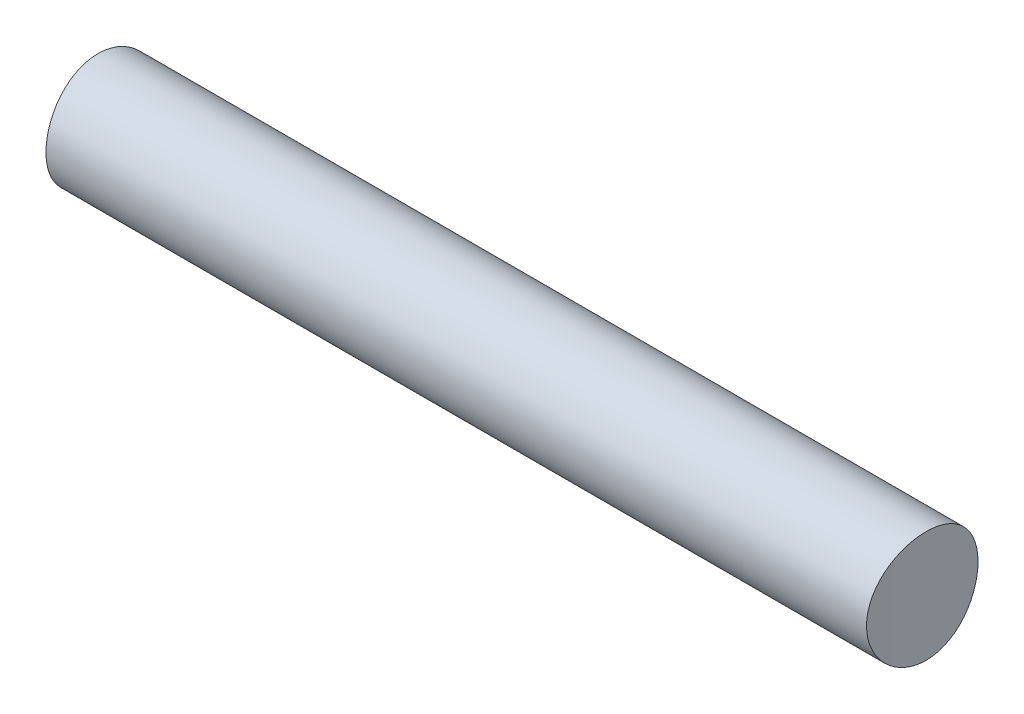
ISO-10303-21;
HEADER;
FILE_DESCRIPTION(('STEP AP214'),'2;1');
FILE_NAME('part.step','',(''),(''),'','','');
FILE_SCHEMA(('AUTOMOTIVE_DESIGN { 1 0 10303 214 1 1 1 1 }'));
ENDSEC;
DATA;
#1=APPLICATION_CONTEXT('core data for automotive mechanical design processes');
#2=APPLICATION_PROTOCOL_DEFINITION('international standard','automotive_design',2000,#1);
#3=PRODUCT_CONTEXT('',#1,'mechanical');
#4=PRODUCT('Part','Part','',(#3));
#5=PRODUCT_RELATED_PRODUCT_CATEGORY('part','',(#4));
#6=PRODUCT_DEFINITION_FORMATION('','',#4);
#7=PRODUCT_DEFINITION_CONTEXT('part definition',#1,'design');
#8=PRODUCT_DEFINITION('design','',#6,#7);
#9=PRODUCT_DEFINITION_SHAPE('','',#8);
#10=(LENGTH_UNIT() NAMED_UNIT(*) SI_UNIT(.MILLI.,.METRE.));
#11=(NAMED_UNIT(*) PLANE_ANGLE_UNIT() SI_UNIT($,.RADIAN.));
#12=(NAMED_UNIT(*) SI_UNIT($,.STERADIAN.) SOLID_ANGLE_UNIT());
#13=UNCERTAINTY_MEASURE_WITH_UNIT(LENGTH_MEASURE(1.E-05),#10,'distance_accuracy_value','');
#14=(GEOMETRIC_REPRESENTATION_CONTEXT(3) GLOBAL_UNCERTAINTY_ASSIGNED_CONTEXT((#13)) GLOBAL_UNIT_ASSIGNED_CONTEXT((#10,
#11,#12)) REPRESENTATION_CONTEXT('',''));
#15=CARTESIAN_POINT('',(0.,0.,0.));
#16=DIRECTION('',(0.,0.,1.));
#17=DIRECTION('',(1.,0.,0.));
#18=AXIS2_PLACEMENT_3D('',#15,#16,#17);
#19=CARTESIAN_POINT('',(377.19,0.,0.));
#20=DIRECTION('',(-1.,0.,0.));
#21=DIRECTION('',(0.,0.,1.));
#22=AXIS2_PLACEMENT_3D('',#19,#20,#21);
#23=CYLINDRICAL_SURFACE('',#22,50.8);
#24=CARTESIAN_POINT('',(377.19,50.8,0.));
#25=CARTESIAN_POINT('',(377.189997080666,50.7999910887293,1.42005416751381));
#26=CARTESIAN_POINT('',(377.181959418517,50.7404050555967,2.84033779358179));
#27=CARTESIAN_POINT('',(377.15002498448,50.5024628077088,5.67093162728168));
#28=CARTESIAN_POINT('',(377.12612471164,50.3240803740018,7.08123956377228));
#29=CARTESIAN_POINT('',(377.063109032706,49.8496481870032,9.88296119954703));
#30=CARTESIAN_POINT('',(377.023979455687,49.5534888362399,11.2743560485113));
#31=CARTESIAN_POINT('',(376.931610182656,48.8457324356745,14.0268939814052));
#32=CARTESIAN_POINT('',(376.878371257915,48.4341416957171,15.3880387145139));
#33=CARTESIAN_POINT('',(376.759319352673,47.4988782150782,18.069631434059));
#34=CARTESIAN_POINT('',(376.693515082761,46.9752830883775,19.3901068812732));
#35=CARTESIAN_POINT('',(376.551148179578,45.8196431370322,21.9821261600043));
#36=CARTESIAN_POINT('',(376.474585409053,45.1875969287575,23.2536693669853));
#37=CARTESIAN_POINT('',(376.312851381164,43.8197094509669,25.7387730204389));
#38=CARTESIAN_POINT('',(376.227681623876,43.0838862594847,26.9523435166165));
#39=CARTESIAN_POINT('',(376.051091649812,41.5135623909031,29.313380346541));
#40=CARTESIAN_POINT('',(375.959671422821,40.6790615525554,30.4608465722629));
#41=CARTESIAN_POINT('',(375.772590160578,38.9121988151168,32.6881149210982));
#42=CARTESIAN_POINT('',(375.676907992978,37.9793081539937,33.7674958434706));
#43=CARTESIAN_POINT('',(375.484479327215,36.0261335430481,35.8439586681679));
#44=CARTESIAN_POINT('',(375.387732824407,35.0058492116677,36.8410402111391));
#45=CARTESIAN_POINT('',(375.195894194027,32.884921502177,38.7460172252009));
#46=CARTESIAN_POINT('',(375.1008021532,31.7842739261952,39.6539080314869));
#47=CARTESIAN_POINT('',(374.914963575958,29.5102971406772,41.3740844015491));
#48=CARTESIAN_POINT('',(374.824217043983,28.3369678568936,42.1863698676579));
#49=CARTESIAN_POINT('',(374.649300067522,25.9210128604042,43.7125914757365));
#50=CARTESIAN_POINT('',(374.565156966536,24.6781321281546,44.4261271525618));
#51=CARTESIAN_POINT('',(374.406266196179,22.1360571134005,45.7458845010319));
#52=CARTESIAN_POINT('',(374.331518559156,20.8368626370305,46.3521058032004));
#53=CARTESIAN_POINT('',(374.193584767775,18.1914080217154,47.4527666149802));
#54=CARTESIAN_POINT('',(374.13039821746,16.8451494965576,47.9472099530334));
#55=CARTESIAN_POINT('',(374.017424166578,14.1151434272721,48.8206579684577));
#56=CARTESIAN_POINT('',(373.967636577911,12.7313961297093,49.199663404867));
#57=CARTESIAN_POINT('',(373.883174929733,9.94484574409289,49.8374414082672));
#58=CARTESIAN_POINT('',(373.848411132879,8.54220889534657,50.0969284905781));
#59=CARTESIAN_POINT('',(373.794571157868,5.71978845946698,50.4970844100488));
#60=CARTESIAN_POINT('',(373.775494922845,4.30000493450884,50.6377536779197));
#61=CARTESIAN_POINT('',(373.753586810023,1.45357103086351,50.7992039046772));
#62=CARTESIAN_POINT('',(373.75075426437,0.0269209369067112,50.8199897925276));
#63=CARTESIAN_POINT('',(373.761414543453,-2.82301029717909,50.741527940763));
#64=CARTESIAN_POINT('',(373.774907309587,-4.24629144938304,50.6422806320249));
#65=CARTESIAN_POINT('',(373.817680910169,-7.06978773076906,50.3255679217796));
#66=CARTESIAN_POINT('',(373.8468560164,-8.47009334433739,50.1088941142282));
#67=CARTESIAN_POINT('',(373.920087296474,-11.2473383197211,49.5594704182214));
#68=CARTESIAN_POINT('',(373.964143393957,-12.6242778013985,49.2267211253914));
#69=CARTESIAN_POINT('',(374.065877386537,-15.3451267127181,48.4475969481269));
#70=CARTESIAN_POINT('',(374.123555503203,-16.6890356047067,48.0012202154696));
#71=CARTESIAN_POINT('',(374.250892202807,-19.3344231303682,46.9980977860962));
#72=CARTESIAN_POINT('',(374.32055084354,-20.6359015593171,46.4413515569469));
#73=CARTESIAN_POINT('',(374.470116928529,-23.1914844056134,45.2195466485467));
#74=CARTESIAN_POINT('',(374.550056348931,-24.4454245052079,44.5541482108841));
#75=CARTESIAN_POINT('',(374.717748824615,-26.8928601325922,43.1210508504713));
#76=CARTESIAN_POINT('',(374.805501890341,-28.0863555795933,42.3533517909939));
#77=CARTESIAN_POINT('',(374.986358478023,-30.4047503655013,40.7210156476081));
#78=CARTESIAN_POINT('',(375.079462239214,-31.529646632646,39.8563742276887));
#79=CARTESIAN_POINT('',(375.268412199859,-33.7030773271819,38.0361910451357));
#80=CARTESIAN_POINT('',(375.364258414657,-34.7516113272172,37.0806487738511));
#81=CARTESIAN_POINT('',(375.556794198851,-36.7732300053066,35.0772142902543));
#82=CARTESIAN_POINT('',(375.653484347266,-37.745639512379,34.0286407022232));
#83=CARTESIAN_POINT('',(375.84420520564,-39.5987397490962,31.853124579661));
#84=CARTESIAN_POINT('',(375.938235900506,-40.4794299582968,30.726181600498));
#85=CARTESIAN_POINT('',(376.120983487773,-42.142873730913,28.4017723053141));
#86=CARTESIAN_POINT('',(376.209700347143,-42.925626685569,27.2043055509988));
#87=CARTESIAN_POINT('',(376.379313015373,-44.387594729938,24.7472234548612));
#88=CARTESIAN_POINT('',(376.460208842098,-45.0668100561608,23.4876082550127));
#89=CARTESIAN_POINT('',(376.611922747259,-46.317056007878,20.9145203375956));
#90=CARTESIAN_POINT('',(376.682736463081,-46.8880398358988,19.6010246202247));
#91=CARTESIAN_POINT('',(376.812233230166,-47.9172604010757,16.9299902435469));
#92=CARTESIAN_POINT('',(376.870916266751,-48.3754970018071,15.5724515309499));
#93=CARTESIAN_POINT('',(376.97447726394,-49.1757866713937,12.8230948402628));
#94=CARTESIAN_POINT('',(377.019355837888,-49.5178449022272,11.4312783881316));
#95=CARTESIAN_POINT('',(377.094028737034,-50.0832213322281,8.62333716440756));
#96=CARTESIAN_POINT('',(377.123823165098,-50.3065403411427,7.20721255865315));
#97=CARTESIAN_POINT('',(377.167306143001,-50.6314770462662,4.37193976004274));
#98=CARTESIAN_POINT('',(377.181117571209,-50.7340233607316,2.95289981241138));
#99=CARTESIAN_POINT('',(377.192659781363,-50.8197631624144,0.111156781642044));
#100=CARTESIAN_POINT('',(377.190390645943,-50.8029572629557,-1.31154628263446));
#101=CARTESIAN_POINT('',(377.169836133904,-50.6501222728541,-4.15038128017528));
#102=CARTESIAN_POINT('',(377.151551135842,-50.514096000139,-5.56651336795781));
#103=CARTESIAN_POINT('',(377.099481629302,-50.1238492654749,-8.3821056574258));
#104=CARTESIAN_POINT('',(377.065697130977,-49.8696288809486,-9.78156587003149));
#105=CARTESIAN_POINT('',(376.983739440633,-49.2461034551017,-12.5484953313223));
#106=CARTESIAN_POINT('',(376.935622209323,-48.8772457649865,-13.9160670936087));
#107=CARTESIAN_POINT('',(376.826295196302,-48.0268497676652,-16.6151672246871));
#108=CARTESIAN_POINT('',(376.76508545987,-47.545311850144,-17.9466957181107));
#109=CARTESIAN_POINT('',(376.631273640436,-46.4730347850442,-20.564477933083));
#110=CARTESIAN_POINT('',(376.558671217591,-45.8822923798172,-21.8507303026494));
#111=CARTESIAN_POINT('',(376.404088392101,-44.5958428741339,-24.3690386384449));
#112=CARTESIAN_POINT('',(376.32210793186,-43.9001351290315,-25.6010942717639));
#113=CARTESIAN_POINT('',(376.150528127123,-42.4042311225334,-28.0096922949459));
#114=CARTESIAN_POINT('',(376.060886413218,-41.6034386623946,-29.1858614035228));
#115=CARTESIAN_POINT('',(375.876912709067,-39.9062500184565,-31.4666789484767));
#116=CARTESIAN_POINT('',(375.782580702527,-39.0098535024884,-32.5713271363384));
#117=CARTESIAN_POINT('',(375.591857729981,-37.1276689798211,-34.7015326977636));
#118=CARTESIAN_POINT('',(375.495466679887,-36.1418773169766,-35.7270868333059));
#119=CARTESIAN_POINT('',(375.303325089552,-34.0877554773833,-37.6919752525685));
#120=CARTESIAN_POINT('',(375.207574551634,-33.0194250015213,-38.6313092238076));
#121=CARTESIAN_POINT('',(375.018772795653,-30.8002263885641,-40.4231794876395));
#122=CARTESIAN_POINT('',(374.925743773749,-29.6488564250321,-41.2750967522516));
#123=CARTESIAN_POINT('',(374.745710328719,-27.2779799184409,-42.8789007994008));
#124=CARTESIAN_POINT('',(374.658705936293,-26.0584730282304,-43.6307870722233));
#125=CARTESIAN_POINT('',(374.493219291289,-23.5598972815843,-45.0291098812424));
#126=CARTESIAN_POINT('',(374.414736905183,-22.2808293588313,-45.675548069735));
#127=CARTESIAN_POINT('',(374.268558309579,-19.6721459062745,-46.8582720524543));
#128=CARTESIAN_POINT('',(374.200862048153,-18.3425306198558,-47.3945583769813));
#129=CARTESIAN_POINT('',(374.078404197816,-15.6462309187208,-48.351585708764));
#130=CARTESIAN_POINT('',(374.023604704821,-14.2796686336599,-48.7726659193644));
#131=CARTESIAN_POINT('',(373.928273588419,-11.5154441269823,-49.4982461434928));
#132=CARTESIAN_POINT('',(373.887741947311,-10.1177819439512,-49.8027463016536));
#133=CARTESIAN_POINT('',(373.822131431818,-7.30147029740792,-50.2928562558833));
#134=CARTESIAN_POINT('',(373.797051847523,-5.88282180113342,-50.4784715138773));
#135=CARTESIAN_POINT('',(373.76307766362,-3.0347358607362,-50.7294193116289));
#136=CARTESIAN_POINT('',(373.754182968227,-1.60529848051533,-50.7947525632485));
#137=CARTESIAN_POINT('',(373.752844379695,1.24243960947291,-50.8046001230379));
#138=CARTESIAN_POINT('',(373.760268161744,2.66073699316345,-50.7500862582794));
#139=CARTESIAN_POINT('',(373.791081348133,5.48762198179271,-50.5226358637978));
#140=CARTESIAN_POINT('',(373.814470660776,6.8962096424512,-50.3497000142181));
#141=CARTESIAN_POINT('',(373.876540273404,9.69364966301611,-49.8867033940482));
#142=CARTESIAN_POINT('',(373.915220517829,11.0825020946119,-49.596643049032));
#143=CARTESIAN_POINT('',(374.006760489029,13.8306525264275,-48.9015535173431));
#144=CARTESIAN_POINT('',(374.059620247892,15.1899504597553,-48.4965240704842));
#145=CARTESIAN_POINT('',(374.177978186362,17.8687747256842,-47.5747030976463));
#146=CARTESIAN_POINT('',(374.243470075555,19.1883204770908,-47.0579671826642));
#147=CARTESIAN_POINT('',(374.385249037774,21.7791627410001,-45.9163589443662));
#148=CARTESIAN_POINT('',(374.461536098925,23.0504593065797,-45.2914867400111));
#149=CARTESIAN_POINT('',(374.622753421611,25.536045059264,-43.9380576581775));
#150=CARTESIAN_POINT('',(374.707683778327,26.7503336183636,-43.2094996388436));
#151=CARTESIAN_POINT('',(374.883804855418,29.1135673565167,-41.6538291190431));
#152=CARTESIAN_POINT('',(374.974995611742,30.2625121602775,-40.8267160526237));
#153=CARTESIAN_POINT('',(375.161815578347,32.4958433024424,-39.0729018413019));
#154=CARTESIAN_POINT('',(375.257473728601,33.579659784024,-38.1454780193379));
#155=CARTESIAN_POINT('',(375.449866034412,35.6654524914716,-36.2028536765008));
#156=CARTESIAN_POINT('',(375.546600199006,36.6674280293694,-35.1876524179038));
#157=CARTESIAN_POINT('',(375.73844583938,38.5827945662274,-33.0762765594368));
#158=CARTESIAN_POINT('',(375.83355692263,39.4961643799606,-31.9800827044309));
#159=CARTESIAN_POINT('',(376.019458366895,41.2276375617533,-29.7145507743039));
#160=CARTESIAN_POINT('',(376.110248782283,42.0457421288586,-28.5452136200779));
#161=CARTESIAN_POINT('',(376.285342820721,43.5842869333625,-26.1362106675468));
#162=CARTESIAN_POINT('',(376.369616155984,44.3042817790721,-24.8962581588342));
#163=CARTESIAN_POINT('',(376.528842435316,45.6371688940563,-22.3593811957366));
#164=CARTESIAN_POINT('',(376.603794817997,46.2500547132098,-21.0624533161679));
#165=CARTESIAN_POINT('',(376.742171230989,47.3636203685775,-18.422225221494));
#166=CARTESIAN_POINT('',(376.805606483865,47.8644095464858,-17.0789716829433));
#167=CARTESIAN_POINT('',(376.919219482283,48.7507490854018,-14.3546269484132));
#168=CARTESIAN_POINT('',(376.969400296676,49.1363261246333,-12.973544592961));
#169=CARTESIAN_POINT('',(377.041344882295,49.6846783476735,-10.6311065057536));
#170=CARTESIAN_POINT('',(377.067060998021,49.8792501986288,-9.67718423887354));
#171=CARTESIAN_POINT('',(377.111398971091,50.2133323508601,-7.75941286408756));
#172=CARTESIAN_POINT('',(377.1300200096,50.3528362968776,-6.79556262358062));
#173=CARTESIAN_POINT('',(377.159911790532,50.5762319387118,-4.86133169248276));
#174=CARTESIAN_POINT('',(377.171182582201,50.6601240071238,-3.89095104568907));
#175=CARTESIAN_POINT('',(377.186227245981,50.7720077990044,-1.94708263205872));
#176=CARTESIAN_POINT('',(377.190002001508,50.8000061096055,-0.97359524489979));
#177=CARTESIAN_POINT('',(377.19,50.8,0.));
#178=B_SPLINE_CURVE_WITH_KNOTS('',3,(#24,#25,#26,#27,#28,#29,#30,#31,#32,#33,#34,#35,#36,#37,
#38,#39,#40,#41,#42,#43,#44,#45,#46,#47,#48,#49,#50,#51,#52,#53,#54,#55,#56,#57,#58,#59,#60,#61,
#62,#63,#64,#65,#66,#67,#68,#69,#70,#71,#72,#73,#74,#75,#76,#77,#78,#79,#80,#81,#82,#83,#84,#85,
#86,#87,#88,#89,#90,#91,#92,#93,#94,#95,#96,#97,#98,#99,#100,#101,#102,#103,#104,#105,#106,#107,
#108,#109,#110,#111,#112,#113,#114,#115,#116,#117,#118,#119,#120,#121,#122,#123,#124,#125,#126,
#127,#128,#129,#130,#131,#132,#133,#134,#135,#136,#137,#138,#139,#140,#141,#142,#143,#144,#145,
#146,#147,#148,#149,#150,#151,#152,#153,#154,#155,#156,#157,#158,#159,#160,#161,#162,#163,#164,
#165,#166,#167,#168,#169,#170,#171,#172,#173,#174,#175,#176,#177),.UNSPECIFIED.,.T.,.F.,(4,2,2,
2,2,2,2,2,2,2,2,2,2,2,2,2,2,2,2,2,2,2,2,2,2,2,2,2,2,2,2,2,2,2,2,2,2,2,2,2,2,2,2,2,2,2,2,2,2,2,2,
2,2,2,2,2,2,2,2,2,2,2,2,2,2,2,2,2,2,2,2,2,2,2,2,2,4),(0.,4.25929039361777,8.51952114531478,
12.7837255719115,17.0476969490265,21.3087231031965,25.5698036240166,29.8301427759306,
34.0904888897267,38.3750257776639,42.6595813727034,46.9443609370321,51.2291448785117,
55.5308255618571,59.8325210553223,64.1340691915938,68.4355890433115,72.7110482844904,
76.9864920271877,81.2617599852391,85.537012596631,89.7837970582222,94.0305597283369,
98.2773914791748,102.524243717647,106.784639652832,111.045041282194,115.3056335457,
119.566249651477,123.861157086426,128.156088890697,132.45104739013,136.745996078496,
141.042797615135,145.339604350896,149.636220148139,153.932806644052,158.19613652119,
162.459444490063,166.722651692852,170.985856103046,175.232628705741,179.479386621932,
183.726271242419,187.973181946267,192.245323008458,196.517478914356,200.789809624751,
205.062155818415,209.362925322066,213.663716739735,217.964440760601,222.265144076152,
226.553045048171,230.840940700474,235.128639339994,239.416312603652,243.669345928837,
247.922354827409,252.175348272735,256.428351343069,260.679241990492,264.93012796154,
269.181060749727,273.432017950088,277.715946914818,281.999911887247,286.284898624753,
290.569831423898,294.873610986209,299.177649633502,303.477471546357,307.776297030649,
310.696511702487,313.617063291024,316.537595311887,319.457783124958),.UNSPECIFIED.);
#179=CARTESIAN_POINT('',(377.19,50.8,0.));
#180=VERTEX_POINT('',#179);
#181=EDGE_CURVE('E10',#180,#180,#178,.T.);
#182=ORIENTED_EDGE('',*,*,#181,.F.);
#183=EDGE_LOOP('',(#182));
#184=FACE_BOUND('',#183,.T.);
#185=CARTESIAN_POINT('',(-373.753469682891,0.,50.8));
#186=CARTESIAN_POINT('',(-373.753472694899,1.41998842830573,50.7999910823772));
#187=CARTESIAN_POINT('',(-373.761583989822,2.8402063805673,50.7404105226679));
#188=CARTESIAN_POINT('',(-373.793804838614,5.6706670627523,50.5024906288371));
#189=CARTESIAN_POINT('',(-373.817917925356,7.0809075203421,50.324125069354));
#190=CARTESIAN_POINT('',(-373.881474443,9.8824927675437,49.8497390471094));
#191=CARTESIAN_POINT('',(-373.920932165678,11.2738186864402,49.5536088942444));
#192=CARTESIAN_POINT('',(-374.014035740579,14.0262172204638,48.8459245553855));
#193=CARTESIAN_POINT('',(-374.067680817791,15.3872914837445,48.4343766742325));
#194=CARTESIAN_POINT('',(-374.187576473582,18.0687343530686,47.4992166922386));
#195=CARTESIAN_POINT('',(-374.253818221241,19.389130727344,46.9756830673136));
#196=CARTESIAN_POINT('',(-374.397042999269,21.9809986677321,45.8201810314471));
#197=CARTESIAN_POINT('',(-374.474026166711,23.2524696092356,45.1882112367117));
#198=CARTESIAN_POINT('',(-374.636536970795,25.7374416279375,43.8204883214351));
#199=CARTESIAN_POINT('',(-374.722063124564,26.9509527118071,43.0847532031376));
#200=CARTESIAN_POINT('',(-374.899262312711,29.3118871588927,41.5146135183934));
#201=CARTESIAN_POINT('',(-374.990935357541,30.4593104097379,40.6802087841838));
#202=CARTESIAN_POINT('',(-375.178402297135,32.6866380069576,38.9134421294088));
#203=CARTESIAN_POINT('',(-375.274216983321,33.7661128216013,37.9805408663306));
#204=CARTESIAN_POINT('',(-375.466763760832,35.8427642608052,36.0273251434834));
#205=CARTESIAN_POINT('',(-375.563495856211,36.8399405214277,35.0070102971979));
#206=CARTESIAN_POINT('',(-375.755160359975,38.7451028305883,32.8860027562667));
#207=CARTESIAN_POINT('',(-375.850092676723,39.6530843475148,31.7853059826998));
#208=CARTESIAN_POINT('',(-376.035484549353,41.3734350185378,29.5112123476482));
#209=CARTESIAN_POINT('',(-376.125944101148,42.1858040852814,28.3378154197452));
#210=CARTESIAN_POINT('',(-376.300183704451,43.7121203083117,25.9218069066293));
#211=CARTESIAN_POINT('',(-376.383936602184,44.4256751243576,24.6789454477107));
#212=CARTESIAN_POINT('',(-376.541996215852,45.7454727551107,22.1369075307306));
#213=CARTESIAN_POINT('',(-376.61630289963,46.3517152044965,20.8377308809751));
#214=CARTESIAN_POINT('',(-376.753354116421,47.4524196230965,18.1923125375894));
#215=CARTESIAN_POINT('',(-376.81609903474,47.9468853174853,16.8460724141665));
#216=CARTESIAN_POINT('',(-376.928239474117,48.8203789517286,14.1161071901925));
#217=CARTESIAN_POINT('',(-376.977635082119,49.1994076434262,12.7323823338438));
#218=CARTESIAN_POINT('',(-377.061409119834,49.8372309480347,9.94589564393519));
#219=CARTESIAN_POINT('',(-377.095876864894,50.0967412645396,8.54330030093056));
#220=CARTESIAN_POINT('',(-377.14925245446,50.4969498993076,5.7209661727693));
#221=CARTESIAN_POINT('',(-377.168160355457,50.6376486489133,4.30122744987029));
#222=CARTESIAN_POINT('',(-377.18987904773,50.7991652411416,1.45488129105302));
#223=CARTESIAN_POINT('',(-377.192690483675,50.8199878848411,0.0282741325081995));
#224=CARTESIAN_POINT('',(-377.182138009782,50.7416065518977,-2.82157602587724));
#225=CARTESIAN_POINT('',(-377.168774156095,50.6424029919167,-4.24481903737905));
#226=CARTESIAN_POINT('',(-377.126389199258,50.3257556704999,-7.06849264965207));
#227=CARTESIAN_POINT('',(-377.097470214192,50.1090830107495,-8.46901133926936));
#228=CARTESIAN_POINT('',(-377.024851279179,49.5596250903948,-11.2466835622289));
#229=CARTESIAN_POINT('',(-376.981151403561,49.2268404136838,-12.6238372130305));
#230=CARTESIAN_POINT('',(-376.880190262965,48.4476089490248,-15.3451088110173));
#231=CARTESIAN_POINT('',(-376.822928797314,48.001160479177,-16.6892262690384));
#232=CARTESIAN_POINT('',(-376.696439250032,46.9978585813648,-19.3350208089377));
#233=CARTESIAN_POINT('',(-376.62721111239,46.4410046366424,-20.6366976921377));
#234=CARTESIAN_POINT('',(-376.478480539388,45.2190106400198,-23.1925347744197));
#235=CARTESIAN_POINT('',(-376.398947012301,44.5535412461738,-24.4465356893807));
#236=CARTESIAN_POINT('',(-376.231988774512,43.1202923834895,-26.8940807529468));
#237=CARTESIAN_POINT('',(-376.144564053624,42.3525127825725,-28.0876248235017));
#238=CARTESIAN_POINT('',(-375.964250181451,40.720010034201,-30.4061009328788));
#239=CARTESIAN_POINT('',(-375.871360785124,39.8552825379008,-31.5310298902969));
#240=CARTESIAN_POINT('',(-375.682701820471,38.0349262110728,-33.7045078252891));
#241=CARTESIAN_POINT('',(-375.586932236098,37.0792968739965,-34.7530563771776));
#242=CARTESIAN_POINT('',(-375.394413795238,35.0757981951008,-36.7745773160718));
#243=CARTESIAN_POINT('',(-375.29766320125,34.0272566770773,-37.7468834799162));
#244=CARTESIAN_POINT('',(-375.106679743904,31.8518258220061,-39.599780889526));
#245=CARTESIAN_POINT('',(-375.01244689467,30.7249360455982,-40.4803716209018));
#246=CARTESIAN_POINT('',(-374.829175987168,28.4006506835394,-42.1436260670283));
#247=CARTESIAN_POINT('',(-374.74013796664,27.2032545858106,-42.926289070414));
#248=CARTESIAN_POINT('',(-374.569800265949,24.7463280313285,-44.3880904206247));
#249=CARTESIAN_POINT('',(-374.48850056895,23.4867977097722,-45.067228992694));
#250=CARTESIAN_POINT('',(-374.335932522199,20.9137337564267,-46.3174130765292));
#251=CARTESIAN_POINT('',(-374.264669729967,19.6001707222785,-46.8883987629861));
#252=CARTESIAN_POINT('',(-374.134290982748,16.9289956496332,-47.9176137265874));
#253=CARTESIAN_POINT('',(-374.075175043192,15.5713835551809,-48.3758428604917));
#254=CARTESIAN_POINT('',(-373.970813893575,12.8218755815724,-49.1761065592838));
#255=CARTESIAN_POINT('',(-373.925568044732,11.4299812844587,-49.518146475294));
#256=CARTESIAN_POINT('',(-373.850268357603,8.62187915674194,-50.0834744595439));
#257=CARTESIAN_POINT('',(-373.820214413572,7.20567149544662,-50.3067633543684));
#258=CARTESIAN_POINT('',(-373.776353744621,4.37035744752254,-50.631612297656));
#259=CARTESIAN_POINT('',(-373.762421665298,2.95136055424915,-50.7341116528872));
#260=CARTESIAN_POINT('',(-373.750785261474,0.109706235540138,-50.8197650338682));
#261=CARTESIAN_POINT('',(-373.753080852791,-1.31295117086767,-50.8029196787388));
#262=CARTESIAN_POINT('',(-373.773832843544,-4.15168974735437,-50.6500137418153));
#263=CARTESIAN_POINT('',(-373.792288860104,-5.56777107243617,-50.5139559844277));
#264=CARTESIAN_POINT('',(-373.844826011572,-8.38325518313011,-50.1236556049602));
#265=CARTESIAN_POINT('',(-373.878907135831,-9.78265798010948,-49.8694130634336));
#266=CARTESIAN_POINT('',(-373.961544414294,-12.5493057356697,-49.2458906397551));
#267=CARTESIAN_POINT('',(-374.010042565444,-13.9166563050748,-48.877071463234));
#268=CARTESIAN_POINT('',(-374.120177325717,-16.6153189724899,-48.0267906148594));
#269=CARTESIAN_POINT('',(-374.18181388842,-17.9466311978107,-47.5453293409889));
#270=CARTESIAN_POINT('',(-374.316477829863,-20.563994676143,-46.473241669207));
#271=CARTESIAN_POINT('',(-374.389505564351,-21.8500445140694,-45.8826118618486));
#272=CARTESIAN_POINT('',(-374.54489011301,-24.3679674356473,-44.5964209104809));
#273=CARTESIAN_POINT('',(-374.627246985928,-25.599840178076,-43.9008591057024));
#274=CARTESIAN_POINT('',(-374.799505226198,-28.0082990146731,-42.4051516158221));
#275=CARTESIAN_POINT('',(-374.889449603083,-29.1845014564368,-41.6043930777082));
#276=CARTESIAN_POINT('',(-375.073905606562,-31.4653934922186,-39.9072640194043));
#277=CARTESIAN_POINT('',(-375.168417249429,-32.5700828314169,-39.0108931585529));
#278=CARTESIAN_POINT('',(-375.359356536972,-34.7003774375263,-37.1287494411287));
#279=CARTESIAN_POINT('',(-375.455784258086,-35.7259795414425,-36.1429730123198));
#280=CARTESIAN_POINT('',(-375.647852292948,-37.6909697289556,-34.0888684830298));
#281=CARTESIAN_POINT('',(-375.743492603891,-38.6303575056233,-33.0205400886827));
#282=CARTESIAN_POINT('',(-375.931939118748,-40.4223482934288,-30.801319764582));
#283=CARTESIAN_POINT('',(-376.024722188332,-41.27433124021,-29.6499250654213));
#284=CARTESIAN_POINT('',(-376.204154866905,-42.8782627529201,-27.2789860802126));
#285=CARTESIAN_POINT('',(-376.290804444552,-43.6302108076704,-26.0594414459636));
#286=CARTESIAN_POINT('',(-376.455512638224,-45.0286493194832,-23.5607814571894));
#287=CARTESIAN_POINT('',(-376.533571390631,-45.6751414507438,-22.2816670487971));
#288=CARTESIAN_POINT('',(-376.678881936838,-46.8579631528181,-19.672886368282));
#289=CARTESIAN_POINT('',(-376.746133783099,-47.3942932583989,-18.3432203415924));
#290=CARTESIAN_POINT('',(-376.867728181225,-48.3513517905643,-15.6469469651757));
#291=CARTESIAN_POINT('',(-376.922109746179,-48.7724301978371,-14.2804656128628));
#292=CARTESIAN_POINT('',(-377.016684566396,-49.4980189183436,-11.5164107582058));
#293=CARTESIAN_POINT('',(-377.056877839959,-49.8025293819298,-10.1188372959678));
#294=CARTESIAN_POINT('',(-377.121930017349,-50.2926744022017,-7.30270624699587));
#295=CARTESIAN_POINT('',(-377.146789599367,-50.4783142163973,-5.8841495911638));
#296=CARTESIAN_POINT('',(-377.180467562116,-50.7293262894724,-3.03624856334633));
#297=CARTESIAN_POINT('',(-377.189286035144,-50.7946992403336,-1.60690425347757));
#298=CARTESIAN_POINT('',(-377.190625252804,-50.804642074232,1.24088235479648));
#299=CARTESIAN_POINT('',(-377.183274493714,-50.7501644051176,2.65932136026816));
#300=CARTESIAN_POINT('',(-377.152744859446,-50.5227623501185,5.48649391070331));
#301=CARTESIAN_POINT('',(-377.129566073729,-50.349838633687,6.89522751047597));
#302=CARTESIAN_POINT('',(-377.068031630509,-49.8868411921357,9.69296158589983));
#303=CARTESIAN_POINT('',(-377.029676042114,-49.5967680004546,11.0819621513754));
#304=CARTESIAN_POINT('',(-376.938863176415,-48.9016265616903,13.8304096481962));
#305=CARTESIAN_POINT('',(-376.886405868222,-48.4965580627201,15.1898565147996));
#306=CARTESIAN_POINT('',(-376.768884615429,-47.5746263487233,17.8689929242556));
#307=CARTESIAN_POINT('',(-376.703826775923,-47.057817259177,19.1887013644486));
#308=CARTESIAN_POINT('',(-376.562899913279,-45.91603464047,21.7798580798677));
#309=CARTESIAN_POINT('',(-376.487030901826,-45.2910612282245,23.0513064072565));
#310=CARTESIAN_POINT('',(-376.326587252373,-43.9374055209631,25.5371770182375));
#311=CARTESIAN_POINT('',(-376.242012525319,-43.208722165048,26.7515987183076));
#312=CARTESIAN_POINT('',(-376.066500758718,-41.6527812368067,29.1150750718633));
#313=CARTESIAN_POINT('',(-375.975563683342,-40.8255231093576,30.264129357179));
#314=CARTESIAN_POINT('',(-375.789138311148,-39.0715532086618,32.4974616886965));
#315=CARTESIAN_POINT('',(-375.693620724817,-38.1441346650399,33.5811822914601));
#316=CARTESIAN_POINT('',(-375.501363194823,-36.2015408380218,35.6667818229737));
#317=CARTESIAN_POINT('',(-375.404623241006,-35.18636482536,36.6686600714782));
#318=CARTESIAN_POINT('',(-375.212620320598,-33.0750586251827,38.5838353596879));
#319=CARTESIAN_POINT('',(-375.117357713823,-31.9789090794068,39.4971110957727));
#320=CARTESIAN_POINT('',(-374.931024617303,-29.713484596915,41.2284026064403));
#321=CARTESIAN_POINT('',(-374.839954075263,-28.5442105728383,42.0464195695478));
#322=CARTESIAN_POINT('',(-374.664194306962,-26.1352560342112,43.5848596004173));
#323=CARTESIAN_POINT('',(-374.579535468936,-24.8952837985659,44.3048294360605));
#324=CARTESIAN_POINT('',(-374.419484663314,-22.3583695947808,45.6376646419753));
#325=CARTESIAN_POINT('',(-374.344093254514,-21.0614241977331,46.2505235547357));
#326=CARTESIAN_POINT('',(-374.204835659157,-18.4211615754905,47.3640341924746));
#327=CARTESIAN_POINT('',(-374.14095824004,-17.0778910843327,47.8647953918935));
#328=CARTESIAN_POINT('',(-374.026507853681,-14.3535091635168,48.7510784531549));
#329=CARTESIAN_POINT('',(-373.975931804114,-12.9724065827362,49.1366270160346));
#330=CARTESIAN_POINT('',(-373.903404231105,-10.630042044065,49.6849040692688));
#331=CARTESIAN_POINT('',(-373.877474775816,-9.6762160987481,49.8794360514788));
#332=CARTESIAN_POINT('',(-373.832762234865,-7.75863780004027,50.2134501567085));
#333=CARTESIAN_POINT('',(-373.813979973654,-6.79488431463828,50.3529259288919));
#334=CARTESIAN_POINT('',(-373.783826654523,-4.86084711936627,50.576276608027));
#335=CARTESIAN_POINT('',(-373.772455545097,-3.89056345492654,50.6601519013866));
#336=CARTESIAN_POINT('',(-373.757276472361,-1.94688889957041,50.772013361745));
#337=CARTESIAN_POINT('',(-373.753467617956,-0.973498388288068,50.8000061136353));
#338=CARTESIAN_POINT('',(-373.753469682891,0.,50.8));
#339=B_SPLINE_CURVE_WITH_KNOTS('',3,(#185,#186,#187,#188,#189,#190,#191,#192,#193,#194,#195,
#196,#197,#198,#199,#200,#201,#202,#203,#204,#205,#206,#207,#208,#209,#210,#211,#212,#213,#214,
#215,#216,#217,#218,#219,#220,#221,#222,#223,#224,#225,#226,#227,#228,#229,#230,#231,#232,#233,
#234,#235,#236,#237,#238,#239,#240,#241,#242,#243,#244,#245,#246,#247,#248,#249,#250,#251,#252,
#253,#254,#255,#256,#257,#258,#259,#260,#261,#262,#263,#264,#265,#266,#267,#268,#269,#270,#271,
#272,#273,#274,#275,#276,#277,#278,#279,#280,#281,#282,#283,#284,#285,#286,#287,#288,#289,#290,
#291,#292,#293,#294,#295,#296,#297,#298,#299,#300,#301,#302,#303,#304,#305,#306,#307,#308,#309,
#310,#311,#312,#313,#314,#315,#316,#317,#318,#319,#320,#321,#322,#323,#324,#325,#326,#327,#328,
#329,#330,#331,#332,#333,#334,#335,#336,#337,#338),.UNSPECIFIED.,.T.,.F.,(4,2,2,2,2,2,2,2,2,2,2,
2,2,2,2,2,2,2,2,2,2,2,2,2,2,2,2,2,2,2,2,2,2,2,2,2,2,2,2,2,2,2,2,2,2,2,2,2,2,2,2,2,2,2,2,2,2,2,2,
2,2,2,2,2,2,2,2,2,2,2,2,2,2,2,2,2,4),(0.,4.25909306652416,8.51912676782583,12.7831377437393,
17.046915837956,21.3077157489081,25.5685700375419,29.8286860179018,34.0888092416254,
38.3736054819642,42.6584206693588,46.9434534378088,51.2284901210925,55.53008045789,
59.831685438226,64.1331470381923,68.4345806220697,72.7099101579665,76.9852241723141,
81.2603669577616,85.5354949024176,89.782893565187,94.0302708693453,98.2777110262204,
102.525171063903,106.785757972017,111.046350380441,115.307133985159,119.567941334391,
123.862581533035,128.157245817039,132.451941296464,136.746627431533,141.043682300059,
145.340742627322,149.637605025603,153.934437514521,158.197630911225,162.460802191908,
166.723872471323,170.986939845084,175.233082830545,179.479210813918,183.725471430709,
187.971758787825,192.243982665089,196.516221764555,200.788631638343,205.061056721622,
209.361953826683,213.662872908496,217.963723703092,222.264553619284,226.552174687944,
230.839790226295,235.127216115317,239.414617335622,243.668069921597,247.921498467392,
252.174907645463,256.428326140322,260.679688939881,264.931047144158,269.182448840765,
273.433874480235,277.717547597669,282.001256315902,286.285992471155,290.570675160884,
294.874536630239,299.178657481678,303.47855641783,307.777458059191,310.697382959504,
313.617644580231,316.53788590573,319.457783105722),.UNSPECIFIED.);
#340=CARTESIAN_POINT('',(-373.753469682891,0.,50.8));
#341=VERTEX_POINT('',#340);
#342=EDGE_CURVE('E41',#341,#341,#339,.T.);
#343=ORIENTED_EDGE('',*,*,#342,.F.);
#344=EDGE_LOOP('',(#343));
#345=FACE_BOUND('',#344,.T.);
#346=ADVANCED_FACE('F31',(#184,#345),#23,.T.);
#347=CARTESIAN_POINT('',(0.,-50.8,0.));
#348=DIRECTION('',(0.,1.,0.));
#349=DIRECTION('',(0.,0.,1.));
#350=AXIS2_PLACEMENT_3D('',#347,#348,#349);
#351=CYLINDRICAL_SURFACE('',#350,377.19);
#352=ORIENTED_EDGE('',*,*,#181,.T.);
#353=EDGE_LOOP('',(#352));
#354=FACE_BOUND('',#353,.T.);
#355=ADVANCED_FACE('F54',(#354),#351,.T.);
#356=CARTESIAN_POINT('',(0.,-50.8,0.));
#357=DIRECTION('',(0.,1.,0.));
#358=DIRECTION('',(0.,0.,1.));
#359=AXIS2_PLACEMENT_3D('',#356,#357,#358);
#360=CYLINDRICAL_SURFACE('',#359,377.19);
#361=ORIENTED_EDGE('',*,*,#342,.T.);
#362=EDGE_LOOP('',(#361));
#363=FACE_BOUND('',#362,.T.);
#364=ADVANCED_FACE('F51',(#363),#360,.T.);
#365=CLOSED_SHELL('',(#346,#355,#364));
#366=MANIFOLD_SOLID_BREP('B2',#365);
#367=ADVANCED_BREP_SHAPE_REPRESENTATION('',(#18,#366),#14);
#368=SHAPE_DEFINITION_REPRESENTATION(#9,#367);
ENDSEC;
END-ISO-10303-21;
